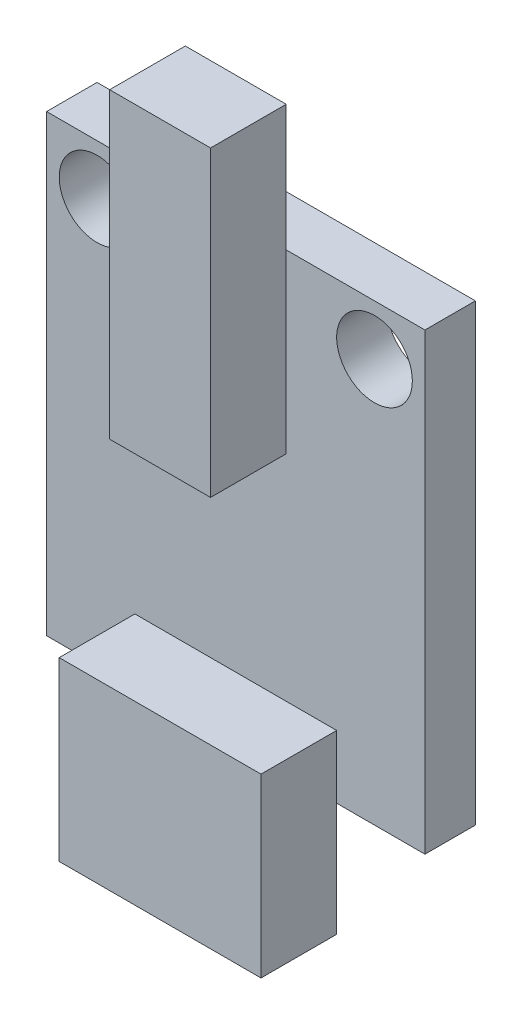
ISO-10303-21;
HEADER;
FILE_DESCRIPTION(('STEP AP214'),'2;1');
FILE_NAME('part.step','',(''),(''),'','','');
FILE_SCHEMA(('AUTOMOTIVE_DESIGN { 1 0 10303 214 1 1 1 1 }'));
ENDSEC;
DATA;
#1=APPLICATION_CONTEXT('core data for automotive mechanical design processes');
#2=APPLICATION_PROTOCOL_DEFINITION('international standard','automotive_design',2000,#1);
#3=PRODUCT_CONTEXT('',#1,'mechanical');
#4=PRODUCT('Part','Part','',(#3));
#5=PRODUCT_RELATED_PRODUCT_CATEGORY('part','',(#4));
#6=PRODUCT_DEFINITION_FORMATION('','',#4);
#7=PRODUCT_DEFINITION_CONTEXT('part definition',#1,'design');
#8=PRODUCT_DEFINITION('design','',#6,#7);
#9=PRODUCT_DEFINITION_SHAPE('','',#8);
#10=(LENGTH_UNIT() NAMED_UNIT(*) SI_UNIT(.MILLI.,.METRE.));
#11=(NAMED_UNIT(*) PLANE_ANGLE_UNIT() SI_UNIT($,.RADIAN.));
#12=(NAMED_UNIT(*) SI_UNIT($,.STERADIAN.) SOLID_ANGLE_UNIT());
#13=UNCERTAINTY_MEASURE_WITH_UNIT(LENGTH_MEASURE(1.E-05),#10,'distance_accuracy_value','');
#14=(GEOMETRIC_REPRESENTATION_CONTEXT(3) GLOBAL_UNCERTAINTY_ASSIGNED_CONTEXT((#13)) GLOBAL_UNIT_ASSIGNED_CONTEXT((#10,
#11,#12)) REPRESENTATION_CONTEXT('',''));
#15=CARTESIAN_POINT('',(0.,0.,0.));
#16=DIRECTION('',(0.,0.,1.));
#17=DIRECTION('',(1.,0.,0.));
#18=AXIS2_PLACEMENT_3D('',#15,#16,#17);
#19=CARTESIAN_POINT('',(0.,0.,2.));
#20=DIRECTION('',(0.,0.,1.));
#21=DIRECTION('',(1.,0.,0.));
#22=AXIS2_PLACEMENT_3D('',#19,#20,#21);
#23=PLANE('',#22);
#24=CARTESIAN_POINT('',(-5.5,7.,2.));
#25=DIRECTION('',(0.,0.,1.));
#26=DIRECTION('',(1.,0.,0.));
#27=AXIS2_PLACEMENT_3D('',#24,#25,#26);
#28=CIRCLE('',#27,1.5);
#29=CARTESIAN_POINT('',(-4.,7.,2.));
#30=VERTEX_POINT('',#29);
#31=EDGE_CURVE('E198',#30,#30,#28,.T.);
#32=ORIENTED_EDGE('',*,*,#31,.F.);
#33=EDGE_LOOP('',(#32));
#34=FACE_BOUND('',#33,.T.);
#35=CARTESIAN_POINT('',(5.5,7.,2.));
#36=DIRECTION('',(0.,0.,1.));
#37=DIRECTION('',(1.,0.,0.));
#38=AXIS2_PLACEMENT_3D('',#35,#36,#37);
#39=CIRCLE('',#38,1.5);
#40=CARTESIAN_POINT('',(7.,7.,2.));
#41=VERTEX_POINT('',#40);
#42=EDGE_CURVE('E194',#41,#41,#39,.T.);
#43=ORIENTED_EDGE('',*,*,#42,.F.);
#44=EDGE_LOOP('',(#43));
#45=FACE_BOUND('',#44,.T.);
#46=DIRECTION('',(1.,0.,0.));
#47=VECTOR('',#46,1.);
#48=CARTESIAN_POINT('',(-7.5,-9.,2.));
#49=LINE('',#48,#47);
#50=CARTESIAN_POINT('',(-7.5,-9.,2.));
#51=VERTEX_POINT('',#50);
#52=CARTESIAN_POINT('',(-4.,-9.,2.));
#53=VERTEX_POINT('',#52);
#54=EDGE_CURVE('E219',#51,#53,#49,.T.);
#55=ORIENTED_EDGE('',*,*,#54,.T.);
#56=DIRECTION('',(0.,-1.,0.));
#57=VECTOR('',#56,1.);
#58=CARTESIAN_POINT('',(-4.,-6.5,2.));
#59=LINE('',#58,#57);
#60=CARTESIAN_POINT('',(-4.,-6.5,2.));
#61=VERTEX_POINT('',#60);
#62=EDGE_CURVE('E277',#61,#53,#59,.T.);
#63=ORIENTED_EDGE('',*,*,#62,.F.);
#64=DIRECTION('',(-1.,0.,0.));
#65=VECTOR('',#64,1.);
#66=CARTESIAN_POINT('',(-4.,-6.5,2.));
#67=LINE('',#66,#65);
#68=CARTESIAN_POINT('',(4.,-6.5,2.));
#69=VERTEX_POINT('',#68);
#70=EDGE_CURVE('E153',#69,#61,#67,.T.);
#71=ORIENTED_EDGE('',*,*,#70,.F.);
#72=DIRECTION('',(0.,-1.,0.));
#73=VECTOR('',#72,1.);
#74=CARTESIAN_POINT('',(4.,0.,2.));
#75=LINE('',#74,#73);
#76=CARTESIAN_POINT('',(4.,-9.,2.));
#77=VERTEX_POINT('',#76);
#78=EDGE_CURVE('E11',#69,#77,#75,.T.);
#79=ORIENTED_EDGE('',*,*,#78,.T.);
#80=CARTESIAN_POINT('',(7.5,-9.,2.));
#81=VERTEX_POINT('',#80);
#82=EDGE_CURVE('E218',#77,#81,#49,.T.);
#83=ORIENTED_EDGE('',*,*,#82,.T.);
#84=DIRECTION('',(0.,1.,0.));
#85=VECTOR('',#84,1.);
#86=CARTESIAN_POINT('',(7.5,9.,2.));
#87=LINE('',#86,#85);
#88=CARTESIAN_POINT('',(7.5,9.,2.));
#89=VERTEX_POINT('',#88);
#90=EDGE_CURVE('E207',#81,#89,#87,.T.);
#91=ORIENTED_EDGE('',*,*,#90,.T.);
#92=DIRECTION('',(-1.,0.,0.));
#93=VECTOR('',#92,1.);
#94=CARTESIAN_POINT('',(-7.5,9.,2.));
#95=LINE('',#94,#93);
#96=CARTESIAN_POINT('',(2.,9.,2.));
#97=VERTEX_POINT('',#96);
#98=EDGE_CURVE('E212',#89,#97,#95,.T.);
#99=ORIENTED_EDGE('',*,*,#98,.T.);
#100=DIRECTION('',(0.,1.,0.));
#101=VECTOR('',#100,1.);
#102=CARTESIAN_POINT('',(2.,14.,2.));
#103=LINE('',#102,#101);
#104=CARTESIAN_POINT('',(2.,2.,2.));
#105=VERTEX_POINT('',#104);
#106=EDGE_CURVE('E179',#105,#97,#103,.T.);
#107=ORIENTED_EDGE('',*,*,#106,.F.);
#108=DIRECTION('',(1.,0.,0.));
#109=VECTOR('',#108,1.);
#110=CARTESIAN_POINT('',(-2.,2.,2.));
#111=LINE('',#110,#109);
#112=CARTESIAN_POINT('',(-2.,2.,2.));
#113=VERTEX_POINT('',#112);
#114=EDGE_CURVE('E56',#113,#105,#111,.T.);
#115=ORIENTED_EDGE('',*,*,#114,.F.);
#116=DIRECTION('',(0.,-1.,0.));
#117=VECTOR('',#116,1.);
#118=CARTESIAN_POINT('',(-2.,14.,2.));
#119=LINE('',#118,#117);
#120=CARTESIAN_POINT('',(-2.,9.,2.));
#121=VERTEX_POINT('',#120);
#122=EDGE_CURVE('E41',#121,#113,#119,.T.);
#123=ORIENTED_EDGE('',*,*,#122,.F.);
#124=CARTESIAN_POINT('',(-7.5,9.,2.));
#125=VERTEX_POINT('',#124);
#126=EDGE_CURVE('E210',#121,#125,#95,.T.);
#127=ORIENTED_EDGE('',*,*,#126,.T.);
#128=DIRECTION('',(0.,-1.,0.));
#129=VECTOR('',#128,1.);
#130=CARTESIAN_POINT('',(-7.5,9.,2.));
#131=LINE('',#130,#129);
#132=EDGE_CURVE('E215',#125,#51,#131,.T.);
#133=ORIENTED_EDGE('',*,*,#132,.T.);
#134=EDGE_LOOP('',(#55,#63,#71,#79,#83,#91,#99,#107,#115,#123,#127,#133));
#135=FACE_BOUND('',#134,.T.);
#136=ADVANCED_FACE('F33',(#34,#45,#135),#23,.T.);
#137=CARTESIAN_POINT('',(7.5,9.,2.));
#138=DIRECTION('',(-1.,0.,0.));
#139=DIRECTION('',(0.,-1.,0.));
#140=AXIS2_PLACEMENT_3D('',#137,#138,#139);
#141=PLANE('',#140);
#142=DIRECTION('',(0.,1.,0.));
#143=VECTOR('',#142,1.);
#144=CARTESIAN_POINT('',(7.5,9.,0.));
#145=LINE('',#144,#143);
#146=CARTESIAN_POINT('',(7.5,-9.,0.));
#147=VERTEX_POINT('',#146);
#148=CARTESIAN_POINT('',(7.5,9.,0.));
#149=VERTEX_POINT('',#148);
#150=EDGE_CURVE('E204',#147,#149,#145,.T.);
#151=ORIENTED_EDGE('',*,*,#150,.T.);
#152=DIRECTION('',(0.,0.,-1.));
#153=VECTOR('',#152,1.);
#154=CARTESIAN_POINT('',(7.5,9.,2.));
#155=LINE('',#154,#153);
#156=EDGE_CURVE('E238',#89,#149,#155,.T.);
#157=ORIENTED_EDGE('',*,*,#156,.F.);
#158=ORIENTED_EDGE('',*,*,#90,.F.);
#159=DIRECTION('',(0.,0.,-1.));
#160=VECTOR('',#159,1.);
#161=CARTESIAN_POINT('',(7.5,-9.,2.));
#162=LINE('',#161,#160);
#163=EDGE_CURVE('E222',#81,#147,#162,.T.);
#164=ORIENTED_EDGE('',*,*,#163,.T.);
#165=EDGE_LOOP('',(#151,#157,#158,#164));
#166=FACE_BOUND('',#165,.T.);
#167=ADVANCED_FACE('F35',(#166),#141,.F.);
#168=CARTESIAN_POINT('',(-7.5,9.,2.));
#169=DIRECTION('',(0.,-1.,0.));
#170=DIRECTION('',(0.,0.,-1.));
#171=AXIS2_PLACEMENT_3D('',#168,#169,#170);
#172=PLANE('',#171);
#173=DIRECTION('',(-1.,0.,0.));
#174=VECTOR('',#173,1.);
#175=CARTESIAN_POINT('',(-7.5,9.,0.));
#176=LINE('',#175,#174);
#177=CARTESIAN_POINT('',(-7.5,9.,0.));
#178=VERTEX_POINT('',#177);
#179=EDGE_CURVE('E226',#149,#178,#176,.T.);
#180=ORIENTED_EDGE('',*,*,#179,.T.);
#181=DIRECTION('',(0.,0.,-1.));
#182=VECTOR('',#181,1.);
#183=CARTESIAN_POINT('',(-7.5,9.,2.));
#184=LINE('',#183,#182);
#185=EDGE_CURVE('E236',#125,#178,#184,.T.);
#186=ORIENTED_EDGE('',*,*,#185,.F.);
#187=ORIENTED_EDGE('',*,*,#126,.F.);
#188=EDGE_CURVE('E216',#97,#121,#95,.T.);
#189=ORIENTED_EDGE('',*,*,#188,.F.);
#190=ORIENTED_EDGE('',*,*,#98,.F.);
#191=ORIENTED_EDGE('',*,*,#156,.T.);
#192=EDGE_LOOP('',(#180,#186,#187,#189,#190,#191));
#193=FACE_BOUND('',#192,.T.);
#194=ADVANCED_FACE('F265',(#193),#172,.F.);
#195=CARTESIAN_POINT('',(-7.5,9.,2.));
#196=DIRECTION('',(1.,0.,0.));
#197=DIRECTION('',(0.,1.,0.));
#198=AXIS2_PLACEMENT_3D('',#195,#196,#197);
#199=PLANE('',#198);
#200=DIRECTION('',(0.,-1.,0.));
#201=VECTOR('',#200,1.);
#202=CARTESIAN_POINT('',(-7.5,9.,0.));
#203=LINE('',#202,#201);
#204=CARTESIAN_POINT('',(-7.5,-9.,0.));
#205=VERTEX_POINT('',#204);
#206=EDGE_CURVE('E228',#178,#205,#203,.T.);
#207=ORIENTED_EDGE('',*,*,#206,.T.);
#208=DIRECTION('',(0.,0.,-1.));
#209=VECTOR('',#208,1.);
#210=CARTESIAN_POINT('',(-7.5,-9.,2.));
#211=LINE('',#210,#209);
#212=EDGE_CURVE('E233',#51,#205,#211,.T.);
#213=ORIENTED_EDGE('',*,*,#212,.F.);
#214=ORIENTED_EDGE('',*,*,#132,.F.);
#215=ORIENTED_EDGE('',*,*,#185,.T.);
#216=EDGE_LOOP('',(#207,#213,#214,#215));
#217=FACE_BOUND('',#216,.T.);
#218=ADVANCED_FACE('F268',(#217),#199,.F.);
#219=CARTESIAN_POINT('',(-7.5,-9.,2.));
#220=DIRECTION('',(0.,1.,0.));
#221=DIRECTION('',(0.,0.,1.));
#222=AXIS2_PLACEMENT_3D('',#219,#220,#221);
#223=PLANE('',#222);
#224=DIRECTION('',(1.,0.,0.));
#225=VECTOR('',#224,1.);
#226=CARTESIAN_POINT('',(-7.5,-9.,0.));
#227=LINE('',#226,#225);
#228=EDGE_CURVE('E211',#205,#147,#227,.T.);
#229=ORIENTED_EDGE('',*,*,#228,.T.);
#230=ORIENTED_EDGE('',*,*,#163,.F.);
#231=ORIENTED_EDGE('',*,*,#82,.F.);
#232=EDGE_CURVE('E223',#53,#77,#49,.T.);
#233=ORIENTED_EDGE('',*,*,#232,.F.);
#234=ORIENTED_EDGE('',*,*,#54,.F.);
#235=ORIENTED_EDGE('',*,*,#212,.T.);
#236=EDGE_LOOP('',(#229,#230,#231,#233,#234,#235));
#237=FACE_BOUND('',#236,.T.);
#238=ADVANCED_FACE('F273',(#237),#223,.F.);
#239=CARTESIAN_POINT('',(0.,0.,0.));
#240=DIRECTION('',(0.,0.,1.));
#241=DIRECTION('',(1.,0.,0.));
#242=AXIS2_PLACEMENT_3D('',#239,#240,#241);
#243=PLANE('',#242);
#244=CARTESIAN_POINT('',(5.5,7.,0.));
#245=DIRECTION('',(0.,0.,1.));
#246=DIRECTION('',(1.,0.,0.));
#247=AXIS2_PLACEMENT_3D('',#244,#245,#246);
#248=CIRCLE('',#247,1.5);
#249=CARTESIAN_POINT('',(7.,7.,0.));
#250=VERTEX_POINT('',#249);
#251=EDGE_CURVE('E195',#250,#250,#248,.T.);
#252=ORIENTED_EDGE('',*,*,#251,.T.);
#253=EDGE_LOOP('',(#252));
#254=FACE_BOUND('',#253,.T.);
#255=CARTESIAN_POINT('',(-5.5,7.,0.));
#256=DIRECTION('',(0.,0.,1.));
#257=DIRECTION('',(1.,0.,0.));
#258=AXIS2_PLACEMENT_3D('',#255,#256,#257);
#259=CIRCLE('',#258,1.5);
#260=CARTESIAN_POINT('',(-4.,7.,0.));
#261=VERTEX_POINT('',#260);
#262=EDGE_CURVE('E201',#261,#261,#259,.T.);
#263=ORIENTED_EDGE('',*,*,#262,.T.);
#264=EDGE_LOOP('',(#263));
#265=FACE_BOUND('',#264,.T.);
#266=ORIENTED_EDGE('',*,*,#150,.F.);
#267=ORIENTED_EDGE('',*,*,#228,.F.);
#268=ORIENTED_EDGE('',*,*,#206,.F.);
#269=ORIENTED_EDGE('',*,*,#179,.F.);
#270=EDGE_LOOP('',(#266,#267,#268,#269));
#271=FACE_BOUND('',#270,.T.);
#272=ADVANCED_FACE('F316',(#254,#265,#271),#243,.F.);
#273=CARTESIAN_POINT('',(-5.5,7.,0.));
#274=DIRECTION('',(0.,0.,1.));
#275=DIRECTION('',(1.,0.,0.));
#276=AXIS2_PLACEMENT_3D('',#273,#274,#275);
#277=CYLINDRICAL_SURFACE('',#276,1.5);
#278=ORIENTED_EDGE('',*,*,#262,.F.);
#279=EDGE_LOOP('',(#278));
#280=FACE_BOUND('',#279,.T.);
#281=ORIENTED_EDGE('',*,*,#31,.T.);
#282=EDGE_LOOP('',(#281));
#283=FACE_BOUND('',#282,.T.);
#284=ADVANCED_FACE('F314',(#280,#283),#277,.F.);
#285=CARTESIAN_POINT('',(5.5,7.,0.));
#286=DIRECTION('',(0.,0.,1.));
#287=DIRECTION('',(1.,0.,0.));
#288=AXIS2_PLACEMENT_3D('',#285,#286,#287);
#289=CYLINDRICAL_SURFACE('',#288,1.5);
#290=ORIENTED_EDGE('',*,*,#251,.F.);
#291=EDGE_LOOP('',(#290));
#292=FACE_BOUND('',#291,.T.);
#293=ORIENTED_EDGE('',*,*,#42,.T.);
#294=EDGE_LOOP('',(#293));
#295=FACE_BOUND('',#294,.T.);
#296=ADVANCED_FACE('F329',(#292,#295),#289,.F.);
#297=CARTESIAN_POINT('',(0.,0.,2.));
#298=DIRECTION('',(0.,0.,1.));
#299=DIRECTION('',(1.,0.,0.));
#300=AXIS2_PLACEMENT_3D('',#297,#298,#299);
#301=PLANE('',#300);
#302=CARTESIAN_POINT('',(2.,14.,2.));
#303=VERTEX_POINT('',#302);
#304=EDGE_CURVE('E178',#97,#303,#103,.T.);
#305=ORIENTED_EDGE('',*,*,#304,.F.);
#306=ORIENTED_EDGE('',*,*,#188,.T.);
#307=CARTESIAN_POINT('',(-2.,14.,2.));
#308=VERTEX_POINT('',#307);
#309=EDGE_CURVE('E159',#308,#121,#119,.T.);
#310=ORIENTED_EDGE('',*,*,#309,.F.);
#311=DIRECTION('',(-1.,0.,0.));
#312=VECTOR('',#311,1.);
#313=CARTESIAN_POINT('',(-2.,14.,2.));
#314=LINE('',#313,#312);
#315=EDGE_CURVE('E170',#303,#308,#314,.T.);
#316=ORIENTED_EDGE('',*,*,#315,.F.);
#317=EDGE_LOOP('',(#305,#306,#310,#316));
#318=FACE_BOUND('',#317,.T.);
#319=ADVANCED_FACE('F261',(#318),#301,.F.);
#320=CARTESIAN_POINT('',(-2.,14.,5.));
#321=DIRECTION('',(1.,0.,0.));
#322=DIRECTION('',(0.,1.,0.));
#323=AXIS2_PLACEMENT_3D('',#320,#321,#322);
#324=PLANE('',#323);
#325=ORIENTED_EDGE('',*,*,#309,.T.);
#326=ORIENTED_EDGE('',*,*,#122,.T.);
#327=DIRECTION('',(0.,0.,-1.));
#328=VECTOR('',#327,1.);
#329=CARTESIAN_POINT('',(-2.,2.,5.));
#330=LINE('',#329,#328);
#331=CARTESIAN_POINT('',(-2.,2.,5.));
#332=VERTEX_POINT('',#331);
#333=EDGE_CURVE('E191',#332,#113,#330,.T.);
#334=ORIENTED_EDGE('',*,*,#333,.F.);
#335=DIRECTION('',(0.,-1.,0.));
#336=VECTOR('',#335,1.);
#337=CARTESIAN_POINT('',(-2.,14.,5.));
#338=LINE('',#337,#336);
#339=CARTESIAN_POINT('',(-2.,14.,5.));
#340=VERTEX_POINT('',#339);
#341=EDGE_CURVE('E166',#340,#332,#338,.T.);
#342=ORIENTED_EDGE('',*,*,#341,.F.);
#343=DIRECTION('',(0.,0.,-1.));
#344=VECTOR('',#343,1.);
#345=CARTESIAN_POINT('',(-2.,14.,5.));
#346=LINE('',#345,#344);
#347=EDGE_CURVE('E175',#340,#308,#346,.T.);
#348=ORIENTED_EDGE('',*,*,#347,.T.);
#349=EDGE_LOOP('',(#325,#326,#334,#342,#348));
#350=FACE_BOUND('',#349,.T.);
#351=ADVANCED_FACE('F244',(#350),#324,.F.);
#352=CARTESIAN_POINT('',(-2.,2.,5.));
#353=DIRECTION('',(0.,1.,0.));
#354=DIRECTION('',(0.,0.,1.));
#355=AXIS2_PLACEMENT_3D('',#352,#353,#354);
#356=PLANE('',#355);
#357=ORIENTED_EDGE('',*,*,#114,.T.);
#358=DIRECTION('',(0.,0.,-1.));
#359=VECTOR('',#358,1.);
#360=CARTESIAN_POINT('',(2.,2.,5.));
#361=LINE('',#360,#359);
#362=CARTESIAN_POINT('',(2.,2.,5.));
#363=VERTEX_POINT('',#362);
#364=EDGE_CURVE('E188',#363,#105,#361,.T.);
#365=ORIENTED_EDGE('',*,*,#364,.F.);
#366=DIRECTION('',(1.,0.,0.));
#367=VECTOR('',#366,1.);
#368=CARTESIAN_POINT('',(-2.,2.,5.));
#369=LINE('',#368,#367);
#370=EDGE_CURVE('E169',#332,#363,#369,.T.);
#371=ORIENTED_EDGE('',*,*,#370,.F.);
#372=ORIENTED_EDGE('',*,*,#333,.T.);
#373=EDGE_LOOP('',(#357,#365,#371,#372));
#374=FACE_BOUND('',#373,.T.);
#375=ADVANCED_FACE('F249',(#374),#356,.F.);
#376=CARTESIAN_POINT('',(2.,14.,5.));
#377=DIRECTION('',(-1.,0.,0.));
#378=DIRECTION('',(0.,-1.,0.));
#379=AXIS2_PLACEMENT_3D('',#376,#377,#378);
#380=PLANE('',#379);
#381=ORIENTED_EDGE('',*,*,#106,.T.);
#382=ORIENTED_EDGE('',*,*,#304,.T.);
#383=DIRECTION('',(0.,0.,-1.));
#384=VECTOR('',#383,1.);
#385=CARTESIAN_POINT('',(2.,14.,5.));
#386=LINE('',#385,#384);
#387=CARTESIAN_POINT('',(2.,14.,5.));
#388=VERTEX_POINT('',#387);
#389=EDGE_CURVE('E185',#388,#303,#386,.T.);
#390=ORIENTED_EDGE('',*,*,#389,.F.);
#391=DIRECTION('',(0.,1.,0.));
#392=VECTOR('',#391,1.);
#393=CARTESIAN_POINT('',(2.,14.,5.));
#394=LINE('',#393,#392);
#395=EDGE_CURVE('E172',#363,#388,#394,.T.);
#396=ORIENTED_EDGE('',*,*,#395,.F.);
#397=ORIENTED_EDGE('',*,*,#364,.T.);
#398=EDGE_LOOP('',(#381,#382,#390,#396,#397));
#399=FACE_BOUND('',#398,.T.);
#400=ADVANCED_FACE('F354',(#399),#380,.F.);
#401=CARTESIAN_POINT('',(-2.,14.,5.));
#402=DIRECTION('',(0.,-1.,0.));
#403=DIRECTION('',(0.,0.,-1.));
#404=AXIS2_PLACEMENT_3D('',#401,#402,#403);
#405=PLANE('',#404);
#406=ORIENTED_EDGE('',*,*,#315,.T.);
#407=ORIENTED_EDGE('',*,*,#347,.F.);
#408=DIRECTION('',(-1.,0.,0.));
#409=VECTOR('',#408,1.);
#410=CARTESIAN_POINT('',(-2.,14.,5.));
#411=LINE('',#410,#409);
#412=EDGE_CURVE('E174',#388,#340,#411,.T.);
#413=ORIENTED_EDGE('',*,*,#412,.F.);
#414=ORIENTED_EDGE('',*,*,#389,.T.);
#415=EDGE_LOOP('',(#406,#407,#413,#414));
#416=FACE_BOUND('',#415,.T.);
#417=ADVANCED_FACE('F363',(#416),#405,.F.);
#418=CARTESIAN_POINT('',(0.,0.,5.));
#419=DIRECTION('',(0.,0.,1.));
#420=DIRECTION('',(1.,0.,0.));
#421=AXIS2_PLACEMENT_3D('',#418,#419,#420);
#422=PLANE('',#421);
#423=ORIENTED_EDGE('',*,*,#341,.T.);
#424=ORIENTED_EDGE('',*,*,#370,.T.);
#425=ORIENTED_EDGE('',*,*,#395,.T.);
#426=ORIENTED_EDGE('',*,*,#412,.T.);
#427=EDGE_LOOP('',(#423,#424,#425,#426));
#428=FACE_BOUND('',#427,.T.);
#429=ADVANCED_FACE('F253',(#428),#422,.T.);
#430=CARTESIAN_POINT('',(0.,0.,2.));
#431=DIRECTION('',(0.,0.,1.));
#432=DIRECTION('',(1.,0.,0.));
#433=AXIS2_PLACEMENT_3D('',#430,#431,#432);
#434=PLANE('',#433);
#435=CARTESIAN_POINT('',(-4.,-13.5,2.));
#436=VERTEX_POINT('',#435);
#437=EDGE_CURVE('E157',#53,#436,#59,.T.);
#438=ORIENTED_EDGE('',*,*,#437,.F.);
#439=ORIENTED_EDGE('',*,*,#232,.T.);
#440=DIRECTION('',(0.,1.,0.));
#441=VECTOR('',#440,1.);
#442=CARTESIAN_POINT('',(4.,-6.5,2.));
#443=LINE('',#442,#441);
#444=CARTESIAN_POINT('',(4.,-13.5,2.));
#445=VERTEX_POINT('',#444);
#446=EDGE_CURVE('E280',#445,#77,#443,.T.);
#447=ORIENTED_EDGE('',*,*,#446,.F.);
#448=DIRECTION('',(1.,0.,0.));
#449=VECTOR('',#448,1.);
#450=CARTESIAN_POINT('',(-4.,-13.5,2.));
#451=LINE('',#450,#449);
#452=EDGE_CURVE('E278',#436,#445,#451,.T.);
#453=ORIENTED_EDGE('',*,*,#452,.F.);
#454=EDGE_LOOP('',(#438,#439,#447,#453));
#455=FACE_BOUND('',#454,.T.);
#456=ADVANCED_FACE('F379',(#455),#434,.F.);
#457=CARTESIAN_POINT('',(-4.,-6.5,5.));
#458=DIRECTION('',(1.,0.,0.));
#459=DIRECTION('',(0.,1.,0.));
#460=AXIS2_PLACEMENT_3D('',#457,#458,#459);
#461=PLANE('',#460);
#462=ORIENTED_EDGE('',*,*,#62,.T.);
#463=ORIENTED_EDGE('',*,*,#437,.T.);
#464=DIRECTION('',(0.,0.,-1.));
#465=VECTOR('',#464,1.);
#466=CARTESIAN_POINT('',(-4.,-13.5,5.));
#467=LINE('',#466,#465);
#468=CARTESIAN_POINT('',(-4.,-13.5,5.));
#469=VERTEX_POINT('',#468);
#470=EDGE_CURVE('E139',#469,#436,#467,.T.);
#471=ORIENTED_EDGE('',*,*,#470,.F.);
#472=DIRECTION('',(0.,-1.,0.));
#473=VECTOR('',#472,1.);
#474=CARTESIAN_POINT('',(-4.,-6.5,5.));
#475=LINE('',#474,#473);
#476=CARTESIAN_POINT('',(-4.,-6.5,5.));
#477=VERTEX_POINT('',#476);
#478=EDGE_CURVE('E145',#477,#469,#475,.T.);
#479=ORIENTED_EDGE('',*,*,#478,.F.);
#480=DIRECTION('',(0.,0.,-1.));
#481=VECTOR('',#480,1.);
#482=CARTESIAN_POINT('',(-4.,-6.5,5.));
#483=LINE('',#482,#481);
#484=EDGE_CURVE('E288',#477,#61,#483,.T.);
#485=ORIENTED_EDGE('',*,*,#484,.T.);
#486=EDGE_LOOP('',(#462,#463,#471,#479,#485));
#487=FACE_BOUND('',#486,.T.);
#488=ADVANCED_FACE('F156',(#487),#461,.F.);
#489=CARTESIAN_POINT('',(-4.,-13.5,5.));
#490=DIRECTION('',(0.,1.,0.));
#491=DIRECTION('',(0.,0.,1.));
#492=AXIS2_PLACEMENT_3D('',#489,#490,#491);
#493=PLANE('',#492);
#494=ORIENTED_EDGE('',*,*,#452,.T.);
#495=DIRECTION('',(0.,0.,-1.));
#496=VECTOR('',#495,1.);
#497=CARTESIAN_POINT('',(4.,-13.5,5.));
#498=LINE('',#497,#496);
#499=CARTESIAN_POINT('',(4.,-13.5,5.));
#500=VERTEX_POINT('',#499);
#501=EDGE_CURVE('E141',#500,#445,#498,.T.);
#502=ORIENTED_EDGE('',*,*,#501,.F.);
#503=DIRECTION('',(1.,0.,0.));
#504=VECTOR('',#503,1.);
#505=CARTESIAN_POINT('',(-4.,-13.5,5.));
#506=LINE('',#505,#504);
#507=EDGE_CURVE('E135',#469,#500,#506,.T.);
#508=ORIENTED_EDGE('',*,*,#507,.F.);
#509=ORIENTED_EDGE('',*,*,#470,.T.);
#510=EDGE_LOOP('',(#494,#502,#508,#509));
#511=FACE_BOUND('',#510,.T.);
#512=ADVANCED_FACE('F137',(#511),#493,.F.);
#513=CARTESIAN_POINT('',(4.,-6.5,5.));
#514=DIRECTION('',(-1.,0.,0.));
#515=DIRECTION('',(0.,-1.,0.));
#516=AXIS2_PLACEMENT_3D('',#513,#514,#515);
#517=PLANE('',#516);
#518=ORIENTED_EDGE('',*,*,#446,.T.);
#519=ORIENTED_EDGE('',*,*,#78,.F.);
#520=DIRECTION('',(0.,0.,-1.));
#521=VECTOR('',#520,1.);
#522=CARTESIAN_POINT('',(4.,-6.5,5.));
#523=LINE('',#522,#521);
#524=CARTESIAN_POINT('',(4.,-6.5,5.));
#525=VERTEX_POINT('',#524);
#526=EDGE_CURVE('E48',#525,#69,#523,.T.);
#527=ORIENTED_EDGE('',*,*,#526,.F.);
#528=DIRECTION('',(0.,1.,0.));
#529=VECTOR('',#528,1.);
#530=CARTESIAN_POINT('',(4.,-6.5,5.));
#531=LINE('',#530,#529);
#532=EDGE_CURVE('E144',#500,#525,#531,.T.);
#533=ORIENTED_EDGE('',*,*,#532,.F.);
#534=ORIENTED_EDGE('',*,*,#501,.T.);
#535=EDGE_LOOP('',(#518,#519,#527,#533,#534));
#536=FACE_BOUND('',#535,.T.);
#537=ADVANCED_FACE('F290',(#536),#517,.F.);
#538=CARTESIAN_POINT('',(-4.,-6.5,5.));
#539=DIRECTION('',(0.,-1.,0.));
#540=DIRECTION('',(0.,0.,-1.));
#541=AXIS2_PLACEMENT_3D('',#538,#539,#540);
#542=PLANE('',#541);
#543=ORIENTED_EDGE('',*,*,#70,.T.);
#544=ORIENTED_EDGE('',*,*,#484,.F.);
#545=DIRECTION('',(-1.,0.,0.));
#546=VECTOR('',#545,1.);
#547=CARTESIAN_POINT('',(-4.,-6.5,5.));
#548=LINE('',#547,#546);
#549=EDGE_CURVE('E149',#525,#477,#548,.T.);
#550=ORIENTED_EDGE('',*,*,#549,.F.);
#551=ORIENTED_EDGE('',*,*,#526,.T.);
#552=EDGE_LOOP('',(#543,#544,#550,#551));
#553=FACE_BOUND('',#552,.T.);
#554=ADVANCED_FACE('F291',(#553),#542,.F.);
#555=CARTESIAN_POINT('',(0.,0.,5.));
#556=DIRECTION('',(0.,0.,1.));
#557=DIRECTION('',(1.,0.,0.));
#558=AXIS2_PLACEMENT_3D('',#555,#556,#557);
#559=PLANE('',#558);
#560=ORIENTED_EDGE('',*,*,#478,.T.);
#561=ORIENTED_EDGE('',*,*,#507,.T.);
#562=ORIENTED_EDGE('',*,*,#532,.T.);
#563=ORIENTED_EDGE('',*,*,#549,.T.);
#564=EDGE_LOOP('',(#560,#561,#562,#563));
#565=FACE_BOUND('',#564,.T.);
#566=ADVANCED_FACE('F148',(#565),#559,.T.);
#567=CLOSED_SHELL('',(#136,#167,#194,#218,#238,#272,#284,#296,#319,#351,#375,#400,#417,#429,
#456,#488,#512,#537,#554,#566));
#568=MANIFOLD_SOLID_BREP('B2',#567);
#569=ADVANCED_BREP_SHAPE_REPRESENTATION('',(#18,#568),#14);
#570=SHAPE_DEFINITION_REPRESENTATION(#9,#569);
ENDSEC;
END-ISO-10303-21;
